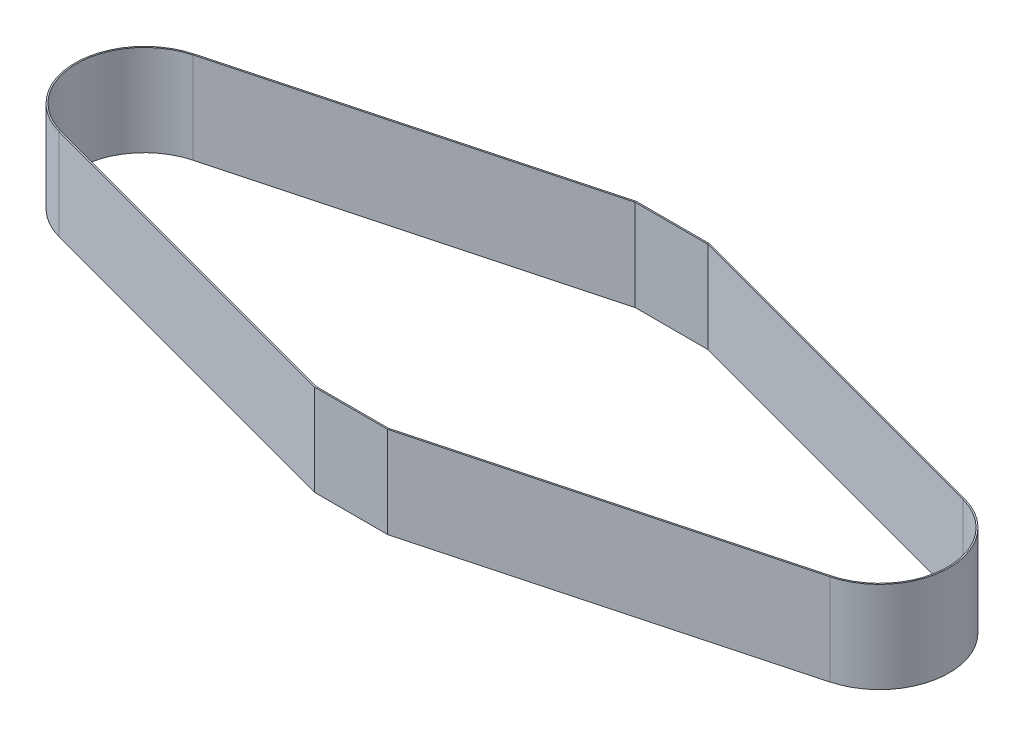
ISO-10303-21;
HEADER;
FILE_DESCRIPTION(('STEP AP214'),'2;1');
FILE_NAME('part.step','',(''),(''),'','','');
FILE_SCHEMA(('AUTOMOTIVE_DESIGN { 1 0 10303 214 1 1 1 1 }'));
ENDSEC;
DATA;
#1=APPLICATION_CONTEXT('core data for automotive mechanical design processes');
#2=APPLICATION_PROTOCOL_DEFINITION('international standard','automotive_design',2000,#1);
#3=PRODUCT_CONTEXT('',#1,'mechanical');
#4=PRODUCT('Part','Part','',(#3));
#5=PRODUCT_RELATED_PRODUCT_CATEGORY('part','',(#4));
#6=PRODUCT_DEFINITION_FORMATION('','',#4);
#7=PRODUCT_DEFINITION_CONTEXT('part definition',#1,'design');
#8=PRODUCT_DEFINITION('design','',#6,#7);
#9=PRODUCT_DEFINITION_SHAPE('','',#8);
#10=(LENGTH_UNIT() NAMED_UNIT(*) SI_UNIT(.MILLI.,.METRE.));
#11=(NAMED_UNIT(*) PLANE_ANGLE_UNIT() SI_UNIT($,.RADIAN.));
#12=(NAMED_UNIT(*) SI_UNIT($,.STERADIAN.) SOLID_ANGLE_UNIT());
#13=UNCERTAINTY_MEASURE_WITH_UNIT(LENGTH_MEASURE(1.E-05),#10,'distance_accuracy_value','');
#14=(GEOMETRIC_REPRESENTATION_CONTEXT(3) GLOBAL_UNCERTAINTY_ASSIGNED_CONTEXT((#13)) GLOBAL_UNIT_ASSIGNED_CONTEXT((#10,
#11,#12)) REPRESENTATION_CONTEXT('',''));
#15=CARTESIAN_POINT('',(0.,0.,0.));
#16=DIRECTION('',(0.,0.,1.));
#17=DIRECTION('',(1.,0.,0.));
#18=AXIS2_PLACEMENT_3D('',#15,#16,#17);
#19=CARTESIAN_POINT('',(0.,50.8,0.));
#20=DIRECTION('',(0.,1.,0.));
#21=DIRECTION('',(0.,0.,1.));
#22=AXIS2_PLACEMENT_3D('',#19,#20,#21);
#23=PLANE('',#22);
#24=DIRECTION('',(0.965925826289068,0.,-0.258819045102521));
#25=VECTOR('',#24,1.);
#26=CARTESIAN_POINT('',(450.206196673485,50.8,179.324));
#27=LINE('',#26,#25);
#28=CARTESIAN_POINT('',(450.206196673485,50.8,179.324));
#29=VERTEX_POINT('',#28);
#30=CARTESIAN_POINT('',(839.266451461548,50.8,75.0756189224915));
#31=VERTEX_POINT('',#30);
#32=EDGE_CURVE('E242',#29,#31,#27,.T.);
#33=ORIENTED_EDGE('',*,*,#32,.T.);
#34=CARTESIAN_POINT('',(819.15,50.8,0.));
#35=DIRECTION('',(0.,1.,0.));
#36=DIRECTION('',(0.,0.,1.));
#37=AXIS2_PLACEMENT_3D('',#34,#35,#36);
#38=CIRCLE('',#37,77.724);
#39=CARTESIAN_POINT('',(839.266451461548,50.8,-75.0756189224916));
#40=VERTEX_POINT('',#39);
#41=EDGE_CURVE('E228',#31,#40,#38,.T.);
#42=ORIENTED_EDGE('',*,*,#41,.T.);
#43=DIRECTION('',(-0.965925826289068,0.,-0.258819045102521));
#44=VECTOR('',#43,1.);
#45=CARTESIAN_POINT('',(839.266451461548,50.8,-75.0756189224916));
#46=LINE('',#45,#44);
#47=CARTESIAN_POINT('',(450.206196673485,50.8,-179.324));
#48=VERTEX_POINT('',#47);
#49=EDGE_CURVE('E246',#40,#48,#46,.T.);
#50=ORIENTED_EDGE('',*,*,#49,.T.);
#51=DIRECTION('',(-1.,0.,0.));
#52=VECTOR('',#51,1.);
#53=CARTESIAN_POINT('',(450.206196673485,50.8,-179.324));
#54=LINE('',#53,#52);
#55=CARTESIAN_POINT('',(368.943803326515,50.8,-179.324));
#56=VERTEX_POINT('',#55);
#57=EDGE_CURVE('E249',#48,#56,#54,.T.);
#58=ORIENTED_EDGE('',*,*,#57,.T.);
#59=DIRECTION('',(-0.965925826289068,0.,0.258819045102521));
#60=VECTOR('',#59,1.);
#61=CARTESIAN_POINT('',(368.943803326515,50.8,-179.324));
#62=LINE('',#61,#60);
#63=CARTESIAN_POINT('',(-20.1164514615483,50.8,-75.0756189224916));
#64=VERTEX_POINT('',#63);
#65=EDGE_CURVE('E252',#56,#64,#62,.T.);
#66=ORIENTED_EDGE('',*,*,#65,.T.);
#67=CARTESIAN_POINT('',(0.,50.8,0.));
#68=DIRECTION('',(0.,1.,0.));
#69=DIRECTION('',(0.,0.,1.));
#70=AXIS2_PLACEMENT_3D('',#67,#68,#69);
#71=CIRCLE('',#70,77.724);
#72=CARTESIAN_POINT('',(-20.1164514615483,50.8,75.0756189224916));
#73=VERTEX_POINT('',#72);
#74=EDGE_CURVE('E11',#64,#73,#71,.T.);
#75=ORIENTED_EDGE('',*,*,#74,.T.);
#76=DIRECTION('',(0.965925826289068,0.,0.258819045102521));
#77=VECTOR('',#76,1.);
#78=CARTESIAN_POINT('',(-20.1164514615483,50.8,75.0756189224916));
#79=LINE('',#78,#77);
#80=CARTESIAN_POINT('',(368.943803326515,50.8,179.324));
#81=VERTEX_POINT('',#80);
#82=EDGE_CURVE('E235',#73,#81,#79,.T.);
#83=ORIENTED_EDGE('',*,*,#82,.T.);
#84=DIRECTION('',(1.,0.,0.));
#85=VECTOR('',#84,1.);
#86=CARTESIAN_POINT('',(368.943803326515,50.8,179.324));
#87=LINE('',#86,#85);
#88=EDGE_CURVE('E238',#81,#29,#87,.T.);
#89=ORIENTED_EDGE('',*,*,#88,.T.);
#90=EDGE_LOOP('',(#33,#42,#50,#58,#66,#75,#83,#89));
#91=FACE_BOUND('',#90,.T.);
#92=DIRECTION('',(-0.965925826289068,0.,-0.258819045102521));
#93=VECTOR('',#92,1.);
#94=CARTESIAN_POINT('',(838.872011236812,50.8,-73.603547963227));
#95=LINE('',#94,#93);
#96=CARTESIAN_POINT('',(838.872011236812,50.8,-73.603547963227));
#97=VERTEX_POINT('',#96);
#98=CARTESIAN_POINT('',(450.005558267162,50.8,-177.8));
#99=VERTEX_POINT('',#98);
#100=EDGE_CURVE('E520',#97,#99,#95,.T.);
#101=ORIENTED_EDGE('',*,*,#100,.F.);
#102=CARTESIAN_POINT('',(819.15,50.8,0.));
#103=DIRECTION('',(0.,1.,0.));
#104=DIRECTION('',(0.,0.,1.));
#105=AXIS2_PLACEMENT_3D('',#102,#103,#104);
#106=CIRCLE('',#105,76.1999999999999);
#107=CARTESIAN_POINT('',(838.872011236812,50.8,73.6035479632269));
#108=VERTEX_POINT('',#107);
#109=EDGE_CURVE('E171',#108,#97,#106,.T.);
#110=ORIENTED_EDGE('',*,*,#109,.F.);
#111=DIRECTION('',(0.965925826289068,0.,-0.258819045102521));
#112=VECTOR('',#111,1.);
#113=CARTESIAN_POINT('',(450.005558267162,50.8,177.8));
#114=LINE('',#113,#112);
#115=CARTESIAN_POINT('',(450.005558267162,50.8,177.8));
#116=VERTEX_POINT('',#115);
#117=EDGE_CURVE('E181',#116,#108,#114,.T.);
#118=ORIENTED_EDGE('',*,*,#117,.F.);
#119=DIRECTION('',(1.,0.,0.));
#120=VECTOR('',#119,1.);
#121=CARTESIAN_POINT('',(369.144441732838,50.8,177.8));
#122=LINE('',#121,#120);
#123=CARTESIAN_POINT('',(369.144441732838,50.8,177.8));
#124=VERTEX_POINT('',#123);
#125=EDGE_CURVE('E525',#124,#116,#122,.T.);
#126=ORIENTED_EDGE('',*,*,#125,.F.);
#127=DIRECTION('',(0.965925826289068,0.,0.258819045102521));
#128=VECTOR('',#127,1.);
#129=CARTESIAN_POINT('',(-19.7220112368121,50.8,73.603547963227));
#130=LINE('',#129,#128);
#131=CARTESIAN_POINT('',(-19.7220112368121,50.8,73.603547963227));
#132=VERTEX_POINT('',#131);
#133=EDGE_CURVE('E207',#132,#124,#130,.T.);
#134=ORIENTED_EDGE('',*,*,#133,.F.);
#135=CARTESIAN_POINT('',(0.,50.8,0.));
#136=DIRECTION('',(0.,1.,0.));
#137=DIRECTION('',(0.,0.,1.));
#138=AXIS2_PLACEMENT_3D('',#135,#136,#137);
#139=CIRCLE('',#138,76.2);
#140=CARTESIAN_POINT('',(-19.7220112368121,50.8,-73.603547963227));
#141=VERTEX_POINT('',#140);
#142=EDGE_CURVE('E505',#141,#132,#139,.T.);
#143=ORIENTED_EDGE('',*,*,#142,.F.);
#144=DIRECTION('',(-0.965925826289068,0.,0.258819045102521));
#145=VECTOR('',#144,1.);
#146=CARTESIAN_POINT('',(369.144441732838,50.8,-177.8));
#147=LINE('',#146,#145);
#148=CARTESIAN_POINT('',(369.144441732838,50.8,-177.8));
#149=VERTEX_POINT('',#148);
#150=EDGE_CURVE('E211',#149,#141,#147,.T.);
#151=ORIENTED_EDGE('',*,*,#150,.F.);
#152=DIRECTION('',(-1.,0.,0.));
#153=VECTOR('',#152,1.);
#154=CARTESIAN_POINT('',(450.005558267162,50.8,-177.8));
#155=LINE('',#154,#153);
#156=EDGE_CURVE('E517',#99,#149,#155,.T.);
#157=ORIENTED_EDGE('',*,*,#156,.F.);
#158=EDGE_LOOP('',(#101,#110,#118,#126,#134,#143,#151,#157));
#159=FACE_BOUND('',#158,.T.);
#160=ADVANCED_FACE('F45',(#91,#159),#23,.T.);
#161=CARTESIAN_POINT('',(0.,-50.8,0.));
#162=DIRECTION('',(0.,1.,0.));
#163=DIRECTION('',(0.,0.,1.));
#164=AXIS2_PLACEMENT_3D('',#161,#162,#163);
#165=PLANE('',#164);
#166=DIRECTION('',(-0.965925826289068,0.,-0.258819045102521));
#167=VECTOR('',#166,1.);
#168=CARTESIAN_POINT('',(839.266451461548,-50.8,-75.0756189224916));
#169=LINE('',#168,#167);
#170=CARTESIAN_POINT('',(839.266451461548,-50.8,-75.0756189224916));
#171=VERTEX_POINT('',#170);
#172=CARTESIAN_POINT('',(450.206196673485,-50.8,-179.324));
#173=VERTEX_POINT('',#172);
#174=EDGE_CURVE('E266',#171,#173,#169,.T.);
#175=ORIENTED_EDGE('',*,*,#174,.F.);
#176=CARTESIAN_POINT('',(819.15,-50.8,0.));
#177=DIRECTION('',(0.,1.,0.));
#178=DIRECTION('',(0.,0.,1.));
#179=AXIS2_PLACEMENT_3D('',#176,#177,#178);
#180=CIRCLE('',#179,77.724);
#181=CARTESIAN_POINT('',(839.266451461548,-50.8,75.0756189224915));
#182=VERTEX_POINT('',#181);
#183=EDGE_CURVE('E227',#182,#171,#180,.T.);
#184=ORIENTED_EDGE('',*,*,#183,.F.);
#185=DIRECTION('',(0.965925826289068,0.,-0.258819045102521));
#186=VECTOR('',#185,1.);
#187=CARTESIAN_POINT('',(450.206196673485,-50.8,179.324));
#188=LINE('',#187,#186);
#189=CARTESIAN_POINT('',(450.206196673485,-50.8,179.324));
#190=VERTEX_POINT('',#189);
#191=EDGE_CURVE('E262',#190,#182,#188,.T.);
#192=ORIENTED_EDGE('',*,*,#191,.F.);
#193=DIRECTION('',(1.,0.,0.));
#194=VECTOR('',#193,1.);
#195=CARTESIAN_POINT('',(368.943803326515,-50.8,179.324));
#196=LINE('',#195,#194);
#197=CARTESIAN_POINT('',(368.943803326515,-50.8,179.324));
#198=VERTEX_POINT('',#197);
#199=EDGE_CURVE('E259',#198,#190,#196,.T.);
#200=ORIENTED_EDGE('',*,*,#199,.F.);
#201=DIRECTION('',(0.965925826289068,0.,0.258819045102521));
#202=VECTOR('',#201,1.);
#203=CARTESIAN_POINT('',(-20.1164514615483,-50.8,75.0756189224916));
#204=LINE('',#203,#202);
#205=CARTESIAN_POINT('',(-20.1164514615483,-50.8,75.0756189224916));
#206=VERTEX_POINT('',#205);
#207=EDGE_CURVE('E232',#206,#198,#204,.T.);
#208=ORIENTED_EDGE('',*,*,#207,.F.);
#209=CARTESIAN_POINT('',(0.,-50.8,0.));
#210=DIRECTION('',(0.,1.,0.));
#211=DIRECTION('',(0.,0.,1.));
#212=AXIS2_PLACEMENT_3D('',#209,#210,#211);
#213=CIRCLE('',#212,77.724);
#214=CARTESIAN_POINT('',(-20.1164514615483,-50.8,-75.0756189224916));
#215=VERTEX_POINT('',#214);
#216=EDGE_CURVE('E49',#215,#206,#213,.T.);
#217=ORIENTED_EDGE('',*,*,#216,.F.);
#218=DIRECTION('',(-0.965925826289068,0.,0.258819045102521));
#219=VECTOR('',#218,1.);
#220=CARTESIAN_POINT('',(368.943803326515,-50.8,-179.324));
#221=LINE('',#220,#219);
#222=CARTESIAN_POINT('',(368.943803326515,-50.8,-179.324));
#223=VERTEX_POINT('',#222);
#224=EDGE_CURVE('E239',#223,#215,#221,.T.);
#225=ORIENTED_EDGE('',*,*,#224,.F.);
#226=DIRECTION('',(-1.,0.,0.));
#227=VECTOR('',#226,1.);
#228=CARTESIAN_POINT('',(450.206196673485,-50.8,-179.324));
#229=LINE('',#228,#227);
#230=EDGE_CURVE('E269',#173,#223,#229,.T.);
#231=ORIENTED_EDGE('',*,*,#230,.F.);
#232=EDGE_LOOP('',(#175,#184,#192,#200,#208,#217,#225,#231));
#233=FACE_BOUND('',#232,.T.);
#234=CARTESIAN_POINT('',(819.15,-50.8,0.));
#235=DIRECTION('',(0.,1.,0.));
#236=DIRECTION('',(0.,0.,1.));
#237=AXIS2_PLACEMENT_3D('',#234,#235,#236);
#238=CIRCLE('',#237,76.1999999999999);
#239=CARTESIAN_POINT('',(838.872011236812,-50.8,73.603547963227));
#240=VERTEX_POINT('',#239);
#241=CARTESIAN_POINT('',(838.872011236812,-50.8,-73.603547963227));
#242=VERTEX_POINT('',#241);
#243=EDGE_CURVE('E159',#240,#242,#238,.T.);
#244=ORIENTED_EDGE('',*,*,#243,.T.);
#245=DIRECTION('',(-0.965925826289068,0.,-0.258819045102521));
#246=VECTOR('',#245,1.);
#247=CARTESIAN_POINT('',(838.872011236812,-50.8,-73.603547963227));
#248=LINE('',#247,#246);
#249=CARTESIAN_POINT('',(450.005558267162,-50.8,-177.8));
#250=VERTEX_POINT('',#249);
#251=EDGE_CURVE('E190',#242,#250,#248,.T.);
#252=ORIENTED_EDGE('',*,*,#251,.T.);
#253=DIRECTION('',(-1.,0.,0.));
#254=VECTOR('',#253,1.);
#255=CARTESIAN_POINT('',(450.005558267162,-50.8,-177.8));
#256=LINE('',#255,#254);
#257=CARTESIAN_POINT('',(369.144441732838,-50.8,-177.8));
#258=VERTEX_POINT('',#257);
#259=EDGE_CURVE('E194',#250,#258,#256,.T.);
#260=ORIENTED_EDGE('',*,*,#259,.T.);
#261=DIRECTION('',(-0.965925826289068,0.,0.258819045102521));
#262=VECTOR('',#261,1.);
#263=CARTESIAN_POINT('',(369.144441732838,-50.8,-177.8));
#264=LINE('',#263,#262);
#265=CARTESIAN_POINT('',(-19.7220112368121,-50.8,-73.603547963227));
#266=VERTEX_POINT('',#265);
#267=EDGE_CURVE('E203',#258,#266,#264,.T.);
#268=ORIENTED_EDGE('',*,*,#267,.T.);
#269=CARTESIAN_POINT('',(0.,-50.8,0.));
#270=DIRECTION('',(0.,1.,0.));
#271=DIRECTION('',(0.,0.,1.));
#272=AXIS2_PLACEMENT_3D('',#269,#270,#271);
#273=CIRCLE('',#272,76.2);
#274=CARTESIAN_POINT('',(-19.7220112368121,-50.8,73.603547963227));
#275=VERTEX_POINT('',#274);
#276=EDGE_CURVE('E69',#266,#275,#273,.T.);
#277=ORIENTED_EDGE('',*,*,#276,.T.);
#278=DIRECTION('',(0.965925826289068,0.,0.258819045102521));
#279=VECTOR('',#278,1.);
#280=CARTESIAN_POINT('',(-19.7220112368121,-50.8,73.603547963227));
#281=LINE('',#280,#279);
#282=CARTESIAN_POINT('',(369.144441732838,-50.8,177.8));
#283=VERTEX_POINT('',#282);
#284=EDGE_CURVE('E196',#275,#283,#281,.T.);
#285=ORIENTED_EDGE('',*,*,#284,.T.);
#286=DIRECTION('',(1.,0.,0.));
#287=VECTOR('',#286,1.);
#288=CARTESIAN_POINT('',(369.144441732838,-50.8,177.8));
#289=LINE('',#288,#287);
#290=CARTESIAN_POINT('',(450.005558267162,-50.8,177.8));
#291=VERTEX_POINT('',#290);
#292=EDGE_CURVE('E188',#283,#291,#289,.T.);
#293=ORIENTED_EDGE('',*,*,#292,.T.);
#294=DIRECTION('',(0.965925826289068,0.,-0.258819045102521));
#295=VECTOR('',#294,1.);
#296=CARTESIAN_POINT('',(450.005558267162,-50.8,177.8));
#297=LINE('',#296,#295);
#298=EDGE_CURVE('E178',#291,#240,#297,.T.);
#299=ORIENTED_EDGE('',*,*,#298,.T.);
#300=EDGE_LOOP('',(#244,#252,#260,#268,#277,#285,#293,#299));
#301=FACE_BOUND('',#300,.T.);
#302=ADVANCED_FACE('F185',(#233,#301),#165,.F.);
#303=CARTESIAN_POINT('',(0.,50.8,0.));
#304=DIRECTION('',(0.,-1.,0.));
#305=DIRECTION('',(0.,0.,-1.));
#306=AXIS2_PLACEMENT_3D('',#303,#304,#305);
#307=CYLINDRICAL_SURFACE('',#306,77.724);
#308=DIRECTION('',(0.,-1.,0.));
#309=VECTOR('',#308,1.);
#310=CARTESIAN_POINT('',(-20.1164514615483,50.8,75.0756189224916));
#311=LINE('',#310,#309);
#312=EDGE_CURVE('E301',#73,#206,#311,.T.);
#313=ORIENTED_EDGE('',*,*,#312,.F.);
#314=ORIENTED_EDGE('',*,*,#74,.F.);
#315=DIRECTION('',(0.,-1.,0.));
#316=VECTOR('',#315,1.);
#317=CARTESIAN_POINT('',(-20.1164514615483,50.8,-75.0756189224916));
#318=LINE('',#317,#316);
#319=EDGE_CURVE('E256',#64,#215,#318,.T.);
#320=ORIENTED_EDGE('',*,*,#319,.T.);
#321=ORIENTED_EDGE('',*,*,#216,.T.);
#322=EDGE_LOOP('',(#313,#314,#320,#321));
#323=FACE_BOUND('',#322,.T.);
#324=ADVANCED_FACE('F47',(#323),#307,.T.);
#325=CARTESIAN_POINT('',(-20.1164514615483,50.8,75.0756189224916));
#326=DIRECTION('',(0.258819045102521,0.,-0.965925826289068));
#327=DIRECTION('',(-0.965925826289068,0.,-0.258819045102521));
#328=AXIS2_PLACEMENT_3D('',#325,#326,#327);
#329=PLANE('',#328);
#330=ORIENTED_EDGE('',*,*,#207,.T.);
#331=DIRECTION('',(0.,-1.,0.));
#332=VECTOR('',#331,1.);
#333=CARTESIAN_POINT('',(368.943803326515,50.8,179.324));
#334=LINE('',#333,#332);
#335=EDGE_CURVE('E297',#81,#198,#334,.T.);
#336=ORIENTED_EDGE('',*,*,#335,.F.);
#337=ORIENTED_EDGE('',*,*,#82,.F.);
#338=ORIENTED_EDGE('',*,*,#312,.T.);
#339=EDGE_LOOP('',(#330,#336,#337,#338));
#340=FACE_BOUND('',#339,.T.);
#341=ADVANCED_FACE('F316',(#340),#329,.F.);
#342=CARTESIAN_POINT('',(368.943803326515,50.8,179.324));
#343=DIRECTION('',(0.,0.,-1.));
#344=DIRECTION('',(-1.,0.,0.));
#345=AXIS2_PLACEMENT_3D('',#342,#343,#344);
#346=PLANE('',#345);
#347=ORIENTED_EDGE('',*,*,#199,.T.);
#348=DIRECTION('',(0.,-1.,0.));
#349=VECTOR('',#348,1.);
#350=CARTESIAN_POINT('',(450.206196673485,50.8,179.324));
#351=LINE('',#350,#349);
#352=EDGE_CURVE('E293',#29,#190,#351,.T.);
#353=ORIENTED_EDGE('',*,*,#352,.F.);
#354=ORIENTED_EDGE('',*,*,#88,.F.);
#355=ORIENTED_EDGE('',*,*,#335,.T.);
#356=EDGE_LOOP('',(#347,#353,#354,#355));
#357=FACE_BOUND('',#356,.T.);
#358=ADVANCED_FACE('F319',(#357),#346,.F.);
#359=CARTESIAN_POINT('',(450.206196673485,50.8,179.324));
#360=DIRECTION('',(-0.258819045102521,0.,-0.965925826289068));
#361=DIRECTION('',(-0.965925826289068,0.,0.258819045102521));
#362=AXIS2_PLACEMENT_3D('',#359,#360,#361);
#363=PLANE('',#362);
#364=ORIENTED_EDGE('',*,*,#191,.T.);
#365=DIRECTION('',(0.,-1.,0.));
#366=VECTOR('',#365,1.);
#367=CARTESIAN_POINT('',(839.266451461548,50.8,75.0756189224916));
#368=LINE('',#367,#366);
#369=EDGE_CURVE('E290',#31,#182,#368,.T.);
#370=ORIENTED_EDGE('',*,*,#369,.F.);
#371=ORIENTED_EDGE('',*,*,#32,.F.);
#372=ORIENTED_EDGE('',*,*,#352,.T.);
#373=EDGE_LOOP('',(#364,#370,#371,#372));
#374=FACE_BOUND('',#373,.T.);
#375=ADVANCED_FACE('F341',(#374),#363,.F.);
#376=CARTESIAN_POINT('',(839.266451461548,50.8,-75.0756189224916));
#377=DIRECTION('',(-0.258819045102521,0.,0.965925826289068));
#378=DIRECTION('',(0.965925826289068,0.,0.258819045102521));
#379=AXIS2_PLACEMENT_3D('',#376,#377,#378);
#380=PLANE('',#379);
#381=ORIENTED_EDGE('',*,*,#174,.T.);
#382=DIRECTION('',(0.,-1.,0.));
#383=VECTOR('',#382,1.);
#384=CARTESIAN_POINT('',(450.206196673485,50.8,-179.324));
#385=LINE('',#384,#383);
#386=EDGE_CURVE('E282',#48,#173,#385,.T.);
#387=ORIENTED_EDGE('',*,*,#386,.F.);
#388=ORIENTED_EDGE('',*,*,#49,.F.);
#389=DIRECTION('',(0.,-1.,0.));
#390=VECTOR('',#389,1.);
#391=CARTESIAN_POINT('',(839.266451461548,50.8,-75.0756189224916));
#392=LINE('',#391,#390);
#393=EDGE_CURVE('E286',#40,#171,#392,.T.);
#394=ORIENTED_EDGE('',*,*,#393,.T.);
#395=EDGE_LOOP('',(#381,#387,#388,#394));
#396=FACE_BOUND('',#395,.T.);
#397=ADVANCED_FACE('F337',(#396),#380,.F.);
#398=CARTESIAN_POINT('',(450.206196673485,50.8,-179.324));
#399=DIRECTION('',(0.,0.,1.));
#400=DIRECTION('',(1.,0.,0.));
#401=AXIS2_PLACEMENT_3D('',#398,#399,#400);
#402=PLANE('',#401);
#403=ORIENTED_EDGE('',*,*,#230,.T.);
#404=DIRECTION('',(0.,-1.,0.));
#405=VECTOR('',#404,1.);
#406=CARTESIAN_POINT('',(368.943803326515,50.8,-179.324));
#407=LINE('',#406,#405);
#408=EDGE_CURVE('E278',#56,#223,#407,.T.);
#409=ORIENTED_EDGE('',*,*,#408,.F.);
#410=ORIENTED_EDGE('',*,*,#57,.F.);
#411=ORIENTED_EDGE('',*,*,#386,.T.);
#412=EDGE_LOOP('',(#403,#409,#410,#411));
#413=FACE_BOUND('',#412,.T.);
#414=ADVANCED_FACE('F333',(#413),#402,.F.);
#415=CARTESIAN_POINT('',(368.943803326515,50.8,-179.324));
#416=DIRECTION('',(0.258819045102521,0.,0.965925826289068));
#417=DIRECTION('',(0.965925826289068,0.,-0.258819045102521));
#418=AXIS2_PLACEMENT_3D('',#415,#416,#417);
#419=PLANE('',#418);
#420=ORIENTED_EDGE('',*,*,#224,.T.);
#421=ORIENTED_EDGE('',*,*,#319,.F.);
#422=ORIENTED_EDGE('',*,*,#65,.F.);
#423=ORIENTED_EDGE('',*,*,#408,.T.);
#424=EDGE_LOOP('',(#420,#421,#422,#423));
#425=FACE_BOUND('',#424,.T.);
#426=ADVANCED_FACE('F329',(#425),#419,.F.);
#427=CARTESIAN_POINT('',(819.15,50.8,0.));
#428=DIRECTION('',(0.,-1.,0.));
#429=DIRECTION('',(0.,0.,-1.));
#430=AXIS2_PLACEMENT_3D('',#427,#428,#429);
#431=CYLINDRICAL_SURFACE('',#430,77.724);
#432=ORIENTED_EDGE('',*,*,#41,.F.);
#433=ORIENTED_EDGE('',*,*,#369,.T.);
#434=ORIENTED_EDGE('',*,*,#183,.T.);
#435=ORIENTED_EDGE('',*,*,#393,.F.);
#436=EDGE_LOOP('',(#432,#433,#434,#435));
#437=FACE_BOUND('',#436,.T.);
#438=ADVANCED_FACE('F339',(#437),#431,.T.);
#439=CARTESIAN_POINT('',(-19.7220112368121,50.8,73.603547963227));
#440=DIRECTION('',(0.258819045102521,0.,-0.965925826289068));
#441=DIRECTION('',(-0.965925826289068,0.,-0.258819045102521));
#442=AXIS2_PLACEMENT_3D('',#439,#440,#441);
#443=PLANE('',#442);
#444=ORIENTED_EDGE('',*,*,#284,.F.);
#445=DIRECTION('',(0.,-1.,0.));
#446=VECTOR('',#445,1.);
#447=CARTESIAN_POINT('',(-19.7220112368121,50.8,73.603547963227));
#448=LINE('',#447,#446);
#449=EDGE_CURVE('E224',#132,#275,#448,.T.);
#450=ORIENTED_EDGE('',*,*,#449,.F.);
#451=ORIENTED_EDGE('',*,*,#133,.T.);
#452=DIRECTION('',(0.,-1.,0.));
#453=VECTOR('',#452,1.);
#454=CARTESIAN_POINT('',(369.144441732838,50.8,177.8));
#455=LINE('',#454,#453);
#456=EDGE_CURVE('E221',#124,#283,#455,.T.);
#457=ORIENTED_EDGE('',*,*,#456,.T.);
#458=EDGE_LOOP('',(#444,#450,#451,#457));
#459=FACE_BOUND('',#458,.T.);
#460=ADVANCED_FACE('F404',(#459),#443,.T.);
#461=CARTESIAN_POINT('',(369.144441732838,50.8,177.8));
#462=DIRECTION('',(0.,0.,-1.));
#463=DIRECTION('',(-1.,0.,0.));
#464=AXIS2_PLACEMENT_3D('',#461,#462,#463);
#465=PLANE('',#464);
#466=ORIENTED_EDGE('',*,*,#292,.F.);
#467=ORIENTED_EDGE('',*,*,#456,.F.);
#468=ORIENTED_EDGE('',*,*,#125,.T.);
#469=DIRECTION('',(0.,-1.,0.));
#470=VECTOR('',#469,1.);
#471=CARTESIAN_POINT('',(450.005558267162,50.8,177.8));
#472=LINE('',#471,#470);
#473=EDGE_CURVE('E183',#116,#291,#472,.T.);
#474=ORIENTED_EDGE('',*,*,#473,.T.);
#475=EDGE_LOOP('',(#466,#467,#468,#474));
#476=FACE_BOUND('',#475,.T.);
#477=ADVANCED_FACE('F412',(#476),#465,.T.);
#478=CARTESIAN_POINT('',(450.005558267162,50.8,177.8));
#479=DIRECTION('',(-0.258819045102521,0.,-0.965925826289068));
#480=DIRECTION('',(-0.965925826289068,0.,0.258819045102521));
#481=AXIS2_PLACEMENT_3D('',#478,#479,#480);
#482=PLANE('',#481);
#483=ORIENTED_EDGE('',*,*,#298,.F.);
#484=ORIENTED_EDGE('',*,*,#473,.F.);
#485=ORIENTED_EDGE('',*,*,#117,.T.);
#486=DIRECTION('',(0.,-1.,0.));
#487=VECTOR('',#486,1.);
#488=CARTESIAN_POINT('',(838.872011236812,50.8,73.603547963227));
#489=LINE('',#488,#487);
#490=EDGE_CURVE('E162',#108,#240,#489,.T.);
#491=ORIENTED_EDGE('',*,*,#490,.T.);
#492=EDGE_LOOP('',(#483,#484,#485,#491));
#493=FACE_BOUND('',#492,.T.);
#494=ADVANCED_FACE('F176',(#493),#482,.T.);
#495=CARTESIAN_POINT('',(838.872011236812,50.8,-73.603547963227));
#496=DIRECTION('',(-0.258819045102521,0.,0.965925826289068));
#497=DIRECTION('',(0.965925826289068,0.,0.258819045102521));
#498=AXIS2_PLACEMENT_3D('',#495,#496,#497);
#499=PLANE('',#498);
#500=ORIENTED_EDGE('',*,*,#251,.F.);
#501=DIRECTION('',(0.,-1.,0.));
#502=VECTOR('',#501,1.);
#503=CARTESIAN_POINT('',(838.872011236812,50.8,-73.603547963227));
#504=LINE('',#503,#502);
#505=EDGE_CURVE('E165',#97,#242,#504,.T.);
#506=ORIENTED_EDGE('',*,*,#505,.F.);
#507=ORIENTED_EDGE('',*,*,#100,.T.);
#508=DIRECTION('',(0.,-1.,0.));
#509=VECTOR('',#508,1.);
#510=CARTESIAN_POINT('',(450.005558267162,50.8,-177.8));
#511=LINE('',#510,#509);
#512=EDGE_CURVE('E214',#99,#250,#511,.T.);
#513=ORIENTED_EDGE('',*,*,#512,.T.);
#514=EDGE_LOOP('',(#500,#506,#507,#513));
#515=FACE_BOUND('',#514,.T.);
#516=ADVANCED_FACE('F429',(#515),#499,.T.);
#517=CARTESIAN_POINT('',(450.005558267162,50.8,-177.8));
#518=DIRECTION('',(0.,0.,1.));
#519=DIRECTION('',(1.,0.,0.));
#520=AXIS2_PLACEMENT_3D('',#517,#518,#519);
#521=PLANE('',#520);
#522=ORIENTED_EDGE('',*,*,#259,.F.);
#523=ORIENTED_EDGE('',*,*,#512,.F.);
#524=ORIENTED_EDGE('',*,*,#156,.T.);
#525=DIRECTION('',(0.,-1.,0.));
#526=VECTOR('',#525,1.);
#527=CARTESIAN_POINT('',(369.144441732838,50.8,-177.8));
#528=LINE('',#527,#526);
#529=EDGE_CURVE('E61',#149,#258,#528,.T.);
#530=ORIENTED_EDGE('',*,*,#529,.T.);
#531=EDGE_LOOP('',(#522,#523,#524,#530));
#532=FACE_BOUND('',#531,.T.);
#533=ADVANCED_FACE('F437',(#532),#521,.T.);
#534=CARTESIAN_POINT('',(369.144441732838,50.8,-177.8));
#535=DIRECTION('',(0.258819045102521,0.,0.965925826289068));
#536=DIRECTION('',(0.965925826289068,0.,-0.258819045102521));
#537=AXIS2_PLACEMENT_3D('',#534,#535,#536);
#538=PLANE('',#537);
#539=ORIENTED_EDGE('',*,*,#267,.F.);
#540=ORIENTED_EDGE('',*,*,#529,.F.);
#541=ORIENTED_EDGE('',*,*,#150,.T.);
#542=DIRECTION('',(0.,-1.,0.));
#543=VECTOR('',#542,1.);
#544=CARTESIAN_POINT('',(-19.7220112368121,50.8,-73.603547963227));
#545=LINE('',#544,#543);
#546=EDGE_CURVE('E208',#141,#266,#545,.T.);
#547=ORIENTED_EDGE('',*,*,#546,.T.);
#548=EDGE_LOOP('',(#539,#540,#541,#547));
#549=FACE_BOUND('',#548,.T.);
#550=ADVANCED_FACE('F446',(#549),#538,.T.);
#551=CARTESIAN_POINT('',(0.,50.8,0.));
#552=DIRECTION('',(0.,-1.,0.));
#553=DIRECTION('',(0.,0.,-1.));
#554=AXIS2_PLACEMENT_3D('',#551,#552,#553);
#555=CYLINDRICAL_SURFACE('',#554,76.2);
#556=ORIENTED_EDGE('',*,*,#449,.T.);
#557=ORIENTED_EDGE('',*,*,#276,.F.);
#558=ORIENTED_EDGE('',*,*,#546,.F.);
#559=ORIENTED_EDGE('',*,*,#142,.T.);
#560=EDGE_LOOP('',(#556,#557,#558,#559));
#561=FACE_BOUND('',#560,.T.);
#562=ADVANCED_FACE('F455',(#561),#555,.F.);
#563=CARTESIAN_POINT('',(819.15,50.8,0.));
#564=DIRECTION('',(0.,-1.,0.));
#565=DIRECTION('',(0.,0.,-1.));
#566=AXIS2_PLACEMENT_3D('',#563,#564,#565);
#567=CYLINDRICAL_SURFACE('',#566,76.1999999999999);
#568=ORIENTED_EDGE('',*,*,#490,.F.);
#569=ORIENTED_EDGE('',*,*,#109,.T.);
#570=ORIENTED_EDGE('',*,*,#505,.T.);
#571=ORIENTED_EDGE('',*,*,#243,.F.);
#572=EDGE_LOOP('',(#568,#569,#570,#571));
#573=FACE_BOUND('',#572,.T.);
#574=ADVANCED_FACE('F161',(#573),#567,.F.);
#575=CLOSED_SHELL('',(#160,#302,#324,#341,#358,#375,#397,#414,#426,#438,#460,#477,#494,#516,
#533,#550,#562,#574));
#576=MANIFOLD_SOLID_BREP('B2',#575);
#577=ADVANCED_BREP_SHAPE_REPRESENTATION('',(#18,#576),#14);
#578=SHAPE_DEFINITION_REPRESENTATION(#9,#577);
ENDSEC;
END-ISO-10303-21;
